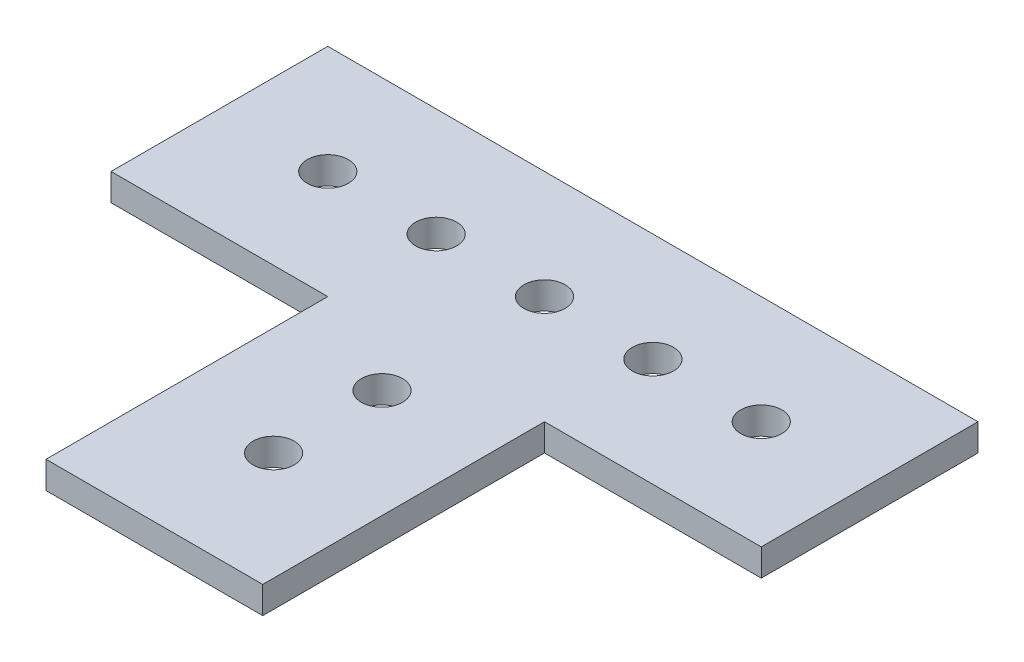
ISO-10303-21;
HEADER;
FILE_DESCRIPTION(('STEP AP214'),'2;1');
FILE_NAME('part.step','',(''),(''),'','','');
FILE_SCHEMA(('AUTOMOTIVE_DESIGN { 1 0 10303 214 1 1 1 1 }'));
ENDSEC;
DATA;
#1=APPLICATION_CONTEXT('core data for automotive mechanical design processes');
#2=APPLICATION_PROTOCOL_DEFINITION('international standard','automotive_design',2000,#1);
#3=PRODUCT_CONTEXT('',#1,'mechanical');
#4=PRODUCT('Part','Part','',(#3));
#5=PRODUCT_RELATED_PRODUCT_CATEGORY('part','',(#4));
#6=PRODUCT_DEFINITION_FORMATION('','',#4);
#7=PRODUCT_DEFINITION_CONTEXT('part definition',#1,'design');
#8=PRODUCT_DEFINITION('design','',#6,#7);
#9=PRODUCT_DEFINITION_SHAPE('','',#8);
#10=(LENGTH_UNIT() NAMED_UNIT(*) SI_UNIT(.MILLI.,.METRE.));
#11=(NAMED_UNIT(*) PLANE_ANGLE_UNIT() SI_UNIT($,.RADIAN.));
#12=(NAMED_UNIT(*) SI_UNIT($,.STERADIAN.) SOLID_ANGLE_UNIT());
#13=UNCERTAINTY_MEASURE_WITH_UNIT(LENGTH_MEASURE(1.E-05),#10,'distance_accuracy_value','');
#14=(GEOMETRIC_REPRESENTATION_CONTEXT(3) GLOBAL_UNCERTAINTY_ASSIGNED_CONTEXT((#13)) GLOBAL_UNIT_ASSIGNED_CONTEXT((#10,
#11,#12)) REPRESENTATION_CONTEXT('',''));
#15=CARTESIAN_POINT('',(0.,0.,0.));
#16=DIRECTION('',(0.,0.,1.));
#17=DIRECTION('',(1.,0.,0.));
#18=AXIS2_PLACEMENT_3D('',#15,#16,#17);
#19=CARTESIAN_POINT('',(0.,3.175,0.));
#20=DIRECTION('',(1.,0.,0.));
#21=DIRECTION('',(0.,0.,-1.));
#22=AXIS2_PLACEMENT_3D('',#19,#20,#21);
#23=PLANE('',#22);
#24=DIRECTION('',(0.,0.,1.));
#25=VECTOR('',#24,1.);
#26=CARTESIAN_POINT('',(0.,0.,0.));
#27=LINE('',#26,#25);
#28=CARTESIAN_POINT('',(0.,0.,-33.02));
#29=VERTEX_POINT('',#28);
#30=CARTESIAN_POINT('',(0.,0.,0.));
#31=VERTEX_POINT('',#30);
#32=EDGE_CURVE('E146',#29,#31,#27,.T.);
#33=ORIENTED_EDGE('',*,*,#32,.T.);
#34=DIRECTION('',(0.,-1.,0.));
#35=VECTOR('',#34,1.);
#36=CARTESIAN_POINT('',(0.,3.175,0.));
#37=LINE('',#36,#35);
#38=CARTESIAN_POINT('',(0.,3.175,0.));
#39=VERTEX_POINT('',#38);
#40=EDGE_CURVE('E11',#39,#31,#37,.T.);
#41=ORIENTED_EDGE('',*,*,#40,.F.);
#42=DIRECTION('',(0.,0.,1.));
#43=VECTOR('',#42,1.);
#44=CARTESIAN_POINT('',(0.,3.175,0.));
#45=LINE('',#44,#43);
#46=CARTESIAN_POINT('',(0.,3.175,-33.02));
#47=VERTEX_POINT('',#46);
#48=EDGE_CURVE('E169',#47,#39,#45,.T.);
#49=ORIENTED_EDGE('',*,*,#48,.F.);
#50=DIRECTION('',(0.,-1.,0.));
#51=VECTOR('',#50,1.);
#52=CARTESIAN_POINT('',(0.,3.175,-33.02));
#53=LINE('',#52,#51);
#54=EDGE_CURVE('E142',#47,#29,#53,.T.);
#55=ORIENTED_EDGE('',*,*,#54,.T.);
#56=EDGE_LOOP('',(#33,#41,#49,#55));
#57=FACE_BOUND('',#56,.T.);
#58=ADVANCED_FACE('F45',(#57),#23,.F.);
#59=CARTESIAN_POINT('',(0.,3.175,0.));
#60=DIRECTION('',(0.,0.,-1.));
#61=DIRECTION('',(-1.,0.,0.));
#62=AXIS2_PLACEMENT_3D('',#59,#60,#61);
#63=PLANE('',#62);
#64=DIRECTION('',(1.,0.,0.));
#65=VECTOR('',#64,1.);
#66=CARTESIAN_POINT('',(0.,0.,0.));
#67=LINE('',#66,#65);
#68=CARTESIAN_POINT('',(25.4,0.,0.));
#69=VERTEX_POINT('',#68);
#70=EDGE_CURVE('E150',#31,#69,#67,.T.);
#71=ORIENTED_EDGE('',*,*,#70,.T.);
#72=DIRECTION('',(0.,-1.,0.));
#73=VECTOR('',#72,1.);
#74=CARTESIAN_POINT('',(25.4,3.175,0.));
#75=LINE('',#74,#73);
#76=CARTESIAN_POINT('',(25.4,3.175,0.));
#77=VERTEX_POINT('',#76);
#78=EDGE_CURVE('E54',#77,#69,#75,.T.);
#79=ORIENTED_EDGE('',*,*,#78,.F.);
#80=DIRECTION('',(1.,0.,0.));
#81=VECTOR('',#80,1.);
#82=CARTESIAN_POINT('',(0.,3.175,0.));
#83=LINE('',#82,#81);
#84=EDGE_CURVE('E105',#39,#77,#83,.T.);
#85=ORIENTED_EDGE('',*,*,#84,.F.);
#86=ORIENTED_EDGE('',*,*,#40,.T.);
#87=EDGE_LOOP('',(#71,#79,#85,#86));
#88=FACE_BOUND('',#87,.T.);
#89=ADVANCED_FACE('F309',(#88),#63,.F.);
#90=CARTESIAN_POINT('',(25.4,3.175,0.));
#91=DIRECTION('',(-1.,0.,0.));
#92=DIRECTION('',(0.,0.,1.));
#93=AXIS2_PLACEMENT_3D('',#90,#91,#92);
#94=PLANE('',#93);
#95=DIRECTION('',(0.,0.,-1.));
#96=VECTOR('',#95,1.);
#97=CARTESIAN_POINT('',(25.4,0.,0.));
#98=LINE('',#97,#96);
#99=CARTESIAN_POINT('',(25.4,0.,-33.02));
#100=VERTEX_POINT('',#99);
#101=EDGE_CURVE('E154',#69,#100,#98,.T.);
#102=ORIENTED_EDGE('',*,*,#101,.T.);
#103=DIRECTION('',(0.,-1.,0.));
#104=VECTOR('',#103,1.);
#105=CARTESIAN_POINT('',(25.4,3.175,-33.02));
#106=LINE('',#105,#104);
#107=CARTESIAN_POINT('',(25.4,3.175,-33.02));
#108=VERTEX_POINT('',#107);
#109=EDGE_CURVE('E180',#108,#100,#106,.T.);
#110=ORIENTED_EDGE('',*,*,#109,.F.);
#111=DIRECTION('',(0.,0.,-1.));
#112=VECTOR('',#111,1.);
#113=CARTESIAN_POINT('',(25.4,3.175,0.));
#114=LINE('',#113,#112);
#115=EDGE_CURVE('E190',#77,#108,#114,.T.);
#116=ORIENTED_EDGE('',*,*,#115,.F.);
#117=ORIENTED_EDGE('',*,*,#78,.T.);
#118=EDGE_LOOP('',(#102,#110,#116,#117));
#119=FACE_BOUND('',#118,.T.);
#120=ADVANCED_FACE('F188',(#119),#94,.F.);
#121=CARTESIAN_POINT('',(25.4,3.175,-33.02));
#122=DIRECTION('',(0.,0.,-1.));
#123=DIRECTION('',(-1.,0.,0.));
#124=AXIS2_PLACEMENT_3D('',#121,#122,#123);
#125=PLANE('',#124);
#126=DIRECTION('',(1.,0.,0.));
#127=VECTOR('',#126,1.);
#128=CARTESIAN_POINT('',(25.4,0.,-33.02));
#129=LINE('',#128,#127);
#130=CARTESIAN_POINT('',(50.8,0.,-33.02));
#131=VERTEX_POINT('',#130);
#132=EDGE_CURVE('E157',#100,#131,#129,.T.);
#133=ORIENTED_EDGE('',*,*,#132,.T.);
#134=DIRECTION('',(0.,-1.,0.));
#135=VECTOR('',#134,1.);
#136=CARTESIAN_POINT('',(50.8,3.175,-33.02));
#137=LINE('',#136,#135);
#138=CARTESIAN_POINT('',(50.8,3.175,-33.02));
#139=VERTEX_POINT('',#138);
#140=EDGE_CURVE('E176',#139,#131,#137,.T.);
#141=ORIENTED_EDGE('',*,*,#140,.F.);
#142=DIRECTION('',(1.,0.,0.));
#143=VECTOR('',#142,1.);
#144=CARTESIAN_POINT('',(25.4,3.175,-33.02));
#145=LINE('',#144,#143);
#146=EDGE_CURVE('E203',#108,#139,#145,.T.);
#147=ORIENTED_EDGE('',*,*,#146,.F.);
#148=ORIENTED_EDGE('',*,*,#109,.T.);
#149=EDGE_LOOP('',(#133,#141,#147,#148));
#150=FACE_BOUND('',#149,.T.);
#151=ADVANCED_FACE('F198',(#150),#125,.F.);
#152=CARTESIAN_POINT('',(50.8,3.175,-33.02));
#153=DIRECTION('',(-1.,0.,0.));
#154=DIRECTION('',(0.,0.,1.));
#155=AXIS2_PLACEMENT_3D('',#152,#153,#154);
#156=PLANE('',#155);
#157=DIRECTION('',(0.,0.,-1.));
#158=VECTOR('',#157,1.);
#159=CARTESIAN_POINT('',(50.8,0.,-33.02));
#160=LINE('',#159,#158);
#161=CARTESIAN_POINT('',(50.8,0.,-58.42));
#162=VERTEX_POINT('',#161);
#163=EDGE_CURVE('E160',#131,#162,#160,.T.);
#164=ORIENTED_EDGE('',*,*,#163,.T.);
#165=DIRECTION('',(0.,-1.,0.));
#166=VECTOR('',#165,1.);
#167=CARTESIAN_POINT('',(50.8,3.175,-58.42));
#168=LINE('',#167,#166);
#169=CARTESIAN_POINT('',(50.8,3.175,-58.42));
#170=VERTEX_POINT('',#169);
#171=EDGE_CURVE('E135',#170,#162,#168,.T.);
#172=ORIENTED_EDGE('',*,*,#171,.F.);
#173=DIRECTION('',(0.,0.,-1.));
#174=VECTOR('',#173,1.);
#175=CARTESIAN_POINT('',(50.8,3.175,-33.02));
#176=LINE('',#175,#174);
#177=EDGE_CURVE('E124',#139,#170,#176,.T.);
#178=ORIENTED_EDGE('',*,*,#177,.F.);
#179=ORIENTED_EDGE('',*,*,#140,.T.);
#180=EDGE_LOOP('',(#164,#172,#178,#179));
#181=FACE_BOUND('',#180,.T.);
#182=ADVANCED_FACE('F201',(#181),#156,.F.);
#183=CARTESIAN_POINT('',(-25.4,3.175,-58.42));
#184=DIRECTION('',(0.,0.,1.));
#185=DIRECTION('',(1.,0.,0.));
#186=AXIS2_PLACEMENT_3D('',#183,#184,#185);
#187=PLANE('',#186);
#188=DIRECTION('',(-1.,0.,0.));
#189=VECTOR('',#188,1.);
#190=CARTESIAN_POINT('',(-25.4,0.,-58.42));
#191=LINE('',#190,#189);
#192=CARTESIAN_POINT('',(-25.4,0.,-58.42));
#193=VERTEX_POINT('',#192);
#194=EDGE_CURVE('E133',#162,#193,#191,.T.);
#195=ORIENTED_EDGE('',*,*,#194,.T.);
#196=DIRECTION('',(0.,-1.,0.));
#197=VECTOR('',#196,1.);
#198=CARTESIAN_POINT('',(-25.4,3.175,-58.42));
#199=LINE('',#198,#197);
#200=CARTESIAN_POINT('',(-25.4,3.175,-58.42));
#201=VERTEX_POINT('',#200);
#202=EDGE_CURVE('E130',#201,#193,#199,.T.);
#203=ORIENTED_EDGE('',*,*,#202,.F.);
#204=DIRECTION('',(-1.,0.,0.));
#205=VECTOR('',#204,1.);
#206=CARTESIAN_POINT('',(-25.4,3.175,-58.42));
#207=LINE('',#206,#205);
#208=EDGE_CURVE('E118',#170,#201,#207,.T.);
#209=ORIENTED_EDGE('',*,*,#208,.F.);
#210=ORIENTED_EDGE('',*,*,#171,.T.);
#211=EDGE_LOOP('',(#195,#203,#209,#210));
#212=FACE_BOUND('',#211,.T.);
#213=ADVANCED_FACE('F131',(#212),#187,.F.);
#214=CARTESIAN_POINT('',(-25.4,3.175,-33.02));
#215=DIRECTION('',(1.,0.,0.));
#216=DIRECTION('',(0.,0.,-1.));
#217=AXIS2_PLACEMENT_3D('',#214,#215,#216);
#218=PLANE('',#217);
#219=DIRECTION('',(0.,0.,1.));
#220=VECTOR('',#219,1.);
#221=CARTESIAN_POINT('',(-25.4,0.,-33.02));
#222=LINE('',#221,#220);
#223=CARTESIAN_POINT('',(-25.4,0.,-33.02));
#224=VERTEX_POINT('',#223);
#225=EDGE_CURVE('E91',#193,#224,#222,.T.);
#226=ORIENTED_EDGE('',*,*,#225,.T.);
#227=DIRECTION('',(0.,-1.,0.));
#228=VECTOR('',#227,1.);
#229=CARTESIAN_POINT('',(-25.4,3.175,-33.02));
#230=LINE('',#229,#228);
#231=CARTESIAN_POINT('',(-25.4,3.175,-33.02));
#232=VERTEX_POINT('',#231);
#233=EDGE_CURVE('E136',#232,#224,#230,.T.);
#234=ORIENTED_EDGE('',*,*,#233,.F.);
#235=DIRECTION('',(0.,0.,1.));
#236=VECTOR('',#235,1.);
#237=CARTESIAN_POINT('',(-25.4,3.175,-33.02));
#238=LINE('',#237,#236);
#239=EDGE_CURVE('E122',#201,#232,#238,.T.);
#240=ORIENTED_EDGE('',*,*,#239,.F.);
#241=ORIENTED_EDGE('',*,*,#202,.T.);
#242=EDGE_LOOP('',(#226,#234,#240,#241));
#243=FACE_BOUND('',#242,.T.);
#244=ADVANCED_FACE('F138',(#243),#218,.F.);
#245=CARTESIAN_POINT('',(-25.4,3.175,-33.02));
#246=DIRECTION('',(0.,0.,-1.));
#247=DIRECTION('',(-1.,0.,0.));
#248=AXIS2_PLACEMENT_3D('',#245,#246,#247);
#249=PLANE('',#248);
#250=DIRECTION('',(1.,0.,0.));
#251=VECTOR('',#250,1.);
#252=CARTESIAN_POINT('',(-25.4,0.,-33.02));
#253=LINE('',#252,#251);
#254=EDGE_CURVE('E97',#224,#29,#253,.T.);
#255=ORIENTED_EDGE('',*,*,#254,.T.);
#256=ORIENTED_EDGE('',*,*,#54,.F.);
#257=DIRECTION('',(1.,0.,0.));
#258=VECTOR('',#257,1.);
#259=CARTESIAN_POINT('',(-25.4,3.175,-33.02));
#260=LINE('',#259,#258);
#261=EDGE_CURVE('E62',#232,#47,#260,.T.);
#262=ORIENTED_EDGE('',*,*,#261,.F.);
#263=ORIENTED_EDGE('',*,*,#233,.T.);
#264=EDGE_LOOP('',(#255,#256,#262,#263));
#265=FACE_BOUND('',#264,.T.);
#266=ADVANCED_FACE('F280',(#265),#249,.F.);
#267=CARTESIAN_POINT('',(0.,3.175,0.));
#268=DIRECTION('',(0.,-1.,0.));
#269=DIRECTION('',(0.,0.,-1.));
#270=AXIS2_PLACEMENT_3D('',#267,#268,#269);
#271=PLANE('',#270);
#272=CARTESIAN_POINT('',(12.7,3.175,-13.97));
#273=DIRECTION('',(0.,1.,0.));
#274=DIRECTION('',(0.,0.,1.));
#275=AXIS2_PLACEMENT_3D('',#272,#273,#274);
#276=CIRCLE('',#275,2.413);
#277=CARTESIAN_POINT('',(12.7,3.175,-11.557));
#278=VERTEX_POINT('',#277);
#279=EDGE_CURVE('E247',#278,#278,#276,.T.);
#280=ORIENTED_EDGE('',*,*,#279,.F.);
#281=EDGE_LOOP('',(#280));
#282=FACE_BOUND('',#281,.T.);
#283=CARTESIAN_POINT('',(12.7,3.175,-45.72));
#284=DIRECTION('',(0.,1.,0.));
#285=DIRECTION('',(0.,0.,1.));
#286=AXIS2_PLACEMENT_3D('',#283,#284,#285);
#287=CIRCLE('',#286,2.413);
#288=CARTESIAN_POINT('',(12.7,3.175,-43.307));
#289=VERTEX_POINT('',#288);
#290=EDGE_CURVE('E229',#289,#289,#287,.T.);
#291=ORIENTED_EDGE('',*,*,#290,.F.);
#292=EDGE_LOOP('',(#291));
#293=FACE_BOUND('',#292,.T.);
#294=CARTESIAN_POINT('',(0.,3.175,-45.72));
#295=DIRECTION('',(0.,1.,0.));
#296=DIRECTION('',(0.,0.,1.));
#297=AXIS2_PLACEMENT_3D('',#294,#295,#296);
#298=CIRCLE('',#297,2.413);
#299=CARTESIAN_POINT('',(0.,3.175,-43.307));
#300=VERTEX_POINT('',#299);
#301=EDGE_CURVE('E255',#300,#300,#298,.T.);
#302=ORIENTED_EDGE('',*,*,#301,.F.);
#303=EDGE_LOOP('',(#302));
#304=FACE_BOUND('',#303,.T.);
#305=CARTESIAN_POINT('',(12.7,3.175,-26.67));
#306=DIRECTION('',(0.,1.,0.));
#307=DIRECTION('',(0.,0.,1.));
#308=AXIS2_PLACEMENT_3D('',#305,#306,#307);
#309=CIRCLE('',#308,2.413);
#310=CARTESIAN_POINT('',(12.7,3.175,-24.257));
#311=VERTEX_POINT('',#310);
#312=EDGE_CURVE('E230',#311,#311,#309,.T.);
#313=ORIENTED_EDGE('',*,*,#312,.F.);
#314=EDGE_LOOP('',(#313));
#315=FACE_BOUND('',#314,.T.);
#316=CARTESIAN_POINT('',(-12.7,3.175,-45.72));
#317=DIRECTION('',(0.,1.,0.));
#318=DIRECTION('',(0.,0.,1.));
#319=AXIS2_PLACEMENT_3D('',#316,#317,#318);
#320=CIRCLE('',#319,2.413);
#321=CARTESIAN_POINT('',(-12.7,3.175,-43.307));
#322=VERTEX_POINT('',#321);
#323=EDGE_CURVE('E239',#322,#322,#320,.T.);
#324=ORIENTED_EDGE('',*,*,#323,.F.);
#325=EDGE_LOOP('',(#324));
#326=FACE_BOUND('',#325,.T.);
#327=CARTESIAN_POINT('',(25.4,3.175,-45.72));
#328=DIRECTION('',(0.,1.,0.));
#329=DIRECTION('',(0.,0.,1.));
#330=AXIS2_PLACEMENT_3D('',#327,#328,#329);
#331=CIRCLE('',#330,2.413);
#332=CARTESIAN_POINT('',(25.4,3.175,-43.307));
#333=VERTEX_POINT('',#332);
#334=EDGE_CURVE('E221',#333,#333,#331,.T.);
#335=ORIENTED_EDGE('',*,*,#334,.F.);
#336=EDGE_LOOP('',(#335));
#337=FACE_BOUND('',#336,.T.);
#338=CARTESIAN_POINT('',(38.1,3.175,-45.72));
#339=DIRECTION('',(0.,1.,0.));
#340=DIRECTION('',(0.,0.,1.));
#341=AXIS2_PLACEMENT_3D('',#338,#339,#340);
#342=CIRCLE('',#341,2.41299999999999);
#343=CARTESIAN_POINT('',(38.1,3.175,-43.307));
#344=VERTEX_POINT('',#343);
#345=EDGE_CURVE('E213',#344,#344,#342,.T.);
#346=ORIENTED_EDGE('',*,*,#345,.F.);
#347=EDGE_LOOP('',(#346));
#348=FACE_BOUND('',#347,.T.);
#349=ORIENTED_EDGE('',*,*,#48,.T.);
#350=ORIENTED_EDGE('',*,*,#84,.T.);
#351=ORIENTED_EDGE('',*,*,#115,.T.);
#352=ORIENTED_EDGE('',*,*,#146,.T.);
#353=ORIENTED_EDGE('',*,*,#177,.T.);
#354=ORIENTED_EDGE('',*,*,#208,.T.);
#355=ORIENTED_EDGE('',*,*,#239,.T.);
#356=ORIENTED_EDGE('',*,*,#261,.T.);
#357=EDGE_LOOP('',(#349,#350,#351,#352,#353,#354,#355,#356));
#358=FACE_BOUND('',#357,.T.);
#359=ADVANCED_FACE('F120',(#282,#293,#304,#315,#326,#337,#348,#358),#271,.F.);
#360=CARTESIAN_POINT('',(0.,0.,0.));
#361=DIRECTION('',(0.,-1.,0.));
#362=DIRECTION('',(0.,0.,-1.));
#363=AXIS2_PLACEMENT_3D('',#360,#361,#362);
#364=PLANE('',#363);
#365=CARTESIAN_POINT('',(12.7,0.,-13.97));
#366=DIRECTION('',(0.,1.,0.));
#367=DIRECTION('',(0.,0.,1.));
#368=AXIS2_PLACEMENT_3D('',#365,#366,#367);
#369=CIRCLE('',#368,2.413);
#370=CARTESIAN_POINT('',(12.7,0.,-11.557));
#371=VERTEX_POINT('',#370);
#372=EDGE_CURVE('E151',#371,#371,#369,.T.);
#373=ORIENTED_EDGE('',*,*,#372,.T.);
#374=EDGE_LOOP('',(#373));
#375=FACE_BOUND('',#374,.T.);
#376=CARTESIAN_POINT('',(12.7,0.,-45.72));
#377=DIRECTION('',(0.,1.,0.));
#378=DIRECTION('',(0.,0.,1.));
#379=AXIS2_PLACEMENT_3D('',#376,#377,#378);
#380=CIRCLE('',#379,2.413);
#381=CARTESIAN_POINT('',(12.7,0.,-43.307));
#382=VERTEX_POINT('',#381);
#383=EDGE_CURVE('E251',#382,#382,#380,.T.);
#384=ORIENTED_EDGE('',*,*,#383,.T.);
#385=EDGE_LOOP('',(#384));
#386=FACE_BOUND('',#385,.T.);
#387=CARTESIAN_POINT('',(0.,0.,-45.72));
#388=DIRECTION('',(0.,1.,0.));
#389=DIRECTION('',(0.,0.,1.));
#390=AXIS2_PLACEMENT_3D('',#387,#388,#389);
#391=CIRCLE('',#390,2.413);
#392=CARTESIAN_POINT('',(0.,0.,-43.307));
#393=VERTEX_POINT('',#392);
#394=EDGE_CURVE('E235',#393,#393,#391,.T.);
#395=ORIENTED_EDGE('',*,*,#394,.T.);
#396=EDGE_LOOP('',(#395));
#397=FACE_BOUND('',#396,.T.);
#398=CARTESIAN_POINT('',(12.7,0.,-26.67));
#399=DIRECTION('',(0.,1.,0.));
#400=DIRECTION('',(0.,0.,1.));
#401=AXIS2_PLACEMENT_3D('',#398,#399,#400);
#402=CIRCLE('',#401,2.413);
#403=CARTESIAN_POINT('',(12.7,0.,-24.257));
#404=VERTEX_POINT('',#403);
#405=EDGE_CURVE('E234',#404,#404,#402,.T.);
#406=ORIENTED_EDGE('',*,*,#405,.T.);
#407=EDGE_LOOP('',(#406));
#408=FACE_BOUND('',#407,.T.);
#409=CARTESIAN_POINT('',(-12.7,0.,-45.72));
#410=DIRECTION('',(0.,1.,0.));
#411=DIRECTION('',(0.,0.,1.));
#412=AXIS2_PLACEMENT_3D('',#409,#410,#411);
#413=CIRCLE('',#412,2.413);
#414=CARTESIAN_POINT('',(-12.7,0.,-43.307));
#415=VERTEX_POINT('',#414);
#416=EDGE_CURVE('E243',#415,#415,#413,.T.);
#417=ORIENTED_EDGE('',*,*,#416,.T.);
#418=EDGE_LOOP('',(#417));
#419=FACE_BOUND('',#418,.T.);
#420=CARTESIAN_POINT('',(25.4,0.,-45.72));
#421=DIRECTION('',(0.,1.,0.));
#422=DIRECTION('',(0.,0.,1.));
#423=AXIS2_PLACEMENT_3D('',#420,#421,#422);
#424=CIRCLE('',#423,2.413);
#425=CARTESIAN_POINT('',(25.4,0.,-43.307));
#426=VERTEX_POINT('',#425);
#427=EDGE_CURVE('E225',#426,#426,#424,.T.);
#428=ORIENTED_EDGE('',*,*,#427,.T.);
#429=EDGE_LOOP('',(#428));
#430=FACE_BOUND('',#429,.T.);
#431=CARTESIAN_POINT('',(38.1,0.,-45.72));
#432=DIRECTION('',(0.,1.,0.));
#433=DIRECTION('',(0.,0.,1.));
#434=AXIS2_PLACEMENT_3D('',#431,#432,#433);
#435=CIRCLE('',#434,2.41299999999999);
#436=CARTESIAN_POINT('',(38.1,0.,-43.307));
#437=VERTEX_POINT('',#436);
#438=EDGE_CURVE('E217',#437,#437,#435,.T.);
#439=ORIENTED_EDGE('',*,*,#438,.T.);
#440=EDGE_LOOP('',(#439));
#441=FACE_BOUND('',#440,.T.);
#442=ORIENTED_EDGE('',*,*,#32,.F.);
#443=ORIENTED_EDGE('',*,*,#254,.F.);
#444=ORIENTED_EDGE('',*,*,#225,.F.);
#445=ORIENTED_EDGE('',*,*,#194,.F.);
#446=ORIENTED_EDGE('',*,*,#163,.F.);
#447=ORIENTED_EDGE('',*,*,#132,.F.);
#448=ORIENTED_EDGE('',*,*,#101,.F.);
#449=ORIENTED_EDGE('',*,*,#70,.F.);
#450=EDGE_LOOP('',(#442,#443,#444,#445,#446,#447,#448,#449));
#451=FACE_BOUND('',#450,.T.);
#452=ADVANCED_FACE('F194',(#375,#386,#397,#408,#419,#430,#441,#451),#364,.T.);
#453=CARTESIAN_POINT('',(38.1,0.,-45.72));
#454=DIRECTION('',(0.,1.,0.));
#455=DIRECTION('',(0.,0.,1.));
#456=AXIS2_PLACEMENT_3D('',#453,#454,#455);
#457=CYLINDRICAL_SURFACE('',#456,2.41299999999999);
#458=ORIENTED_EDGE('',*,*,#438,.F.);
#459=EDGE_LOOP('',(#458));
#460=FACE_BOUND('',#459,.T.);
#461=ORIENTED_EDGE('',*,*,#345,.T.);
#462=EDGE_LOOP('',(#461));
#463=FACE_BOUND('',#462,.T.);
#464=ADVANCED_FACE('F294',(#460,#463),#457,.F.);
#465=CARTESIAN_POINT('',(25.4,0.,-45.72));
#466=DIRECTION('',(0.,1.,0.));
#467=DIRECTION('',(0.,0.,1.));
#468=AXIS2_PLACEMENT_3D('',#465,#466,#467);
#469=CYLINDRICAL_SURFACE('',#468,2.413);
#470=ORIENTED_EDGE('',*,*,#427,.F.);
#471=EDGE_LOOP('',(#470));
#472=FACE_BOUND('',#471,.T.);
#473=ORIENTED_EDGE('',*,*,#334,.T.);
#474=EDGE_LOOP('',(#473));
#475=FACE_BOUND('',#474,.T.);
#476=ADVANCED_FACE('F296',(#472,#475),#469,.F.);
#477=CARTESIAN_POINT('',(-12.7,0.,-45.72));
#478=DIRECTION('',(0.,1.,0.));
#479=DIRECTION('',(0.,0.,1.));
#480=AXIS2_PLACEMENT_3D('',#477,#478,#479);
#481=CYLINDRICAL_SURFACE('',#480,2.413);
#482=ORIENTED_EDGE('',*,*,#416,.F.);
#483=EDGE_LOOP('',(#482));
#484=FACE_BOUND('',#483,.T.);
#485=ORIENTED_EDGE('',*,*,#323,.T.);
#486=EDGE_LOOP('',(#485));
#487=FACE_BOUND('',#486,.T.);
#488=ADVANCED_FACE('F303',(#484,#487),#481,.F.);
#489=CARTESIAN_POINT('',(12.7,0.,-26.67));
#490=DIRECTION('',(0.,1.,0.));
#491=DIRECTION('',(0.,0.,1.));
#492=AXIS2_PLACEMENT_3D('',#489,#490,#491);
#493=CYLINDRICAL_SURFACE('',#492,2.413);
#494=ORIENTED_EDGE('',*,*,#405,.F.);
#495=EDGE_LOOP('',(#494));
#496=FACE_BOUND('',#495,.T.);
#497=ORIENTED_EDGE('',*,*,#312,.T.);
#498=EDGE_LOOP('',(#497));
#499=FACE_BOUND('',#498,.T.);
#500=ADVANCED_FACE('F379',(#496,#499),#493,.F.);
#501=CARTESIAN_POINT('',(0.,0.,-45.72));
#502=DIRECTION('',(0.,1.,0.));
#503=DIRECTION('',(0.,0.,1.));
#504=AXIS2_PLACEMENT_3D('',#501,#502,#503);
#505=CYLINDRICAL_SURFACE('',#504,2.413);
#506=ORIENTED_EDGE('',*,*,#394,.F.);
#507=EDGE_LOOP('',(#506));
#508=FACE_BOUND('',#507,.T.);
#509=ORIENTED_EDGE('',*,*,#301,.T.);
#510=EDGE_LOOP('',(#509));
#511=FACE_BOUND('',#510,.T.);
#512=ADVANCED_FACE('F389',(#508,#511),#505,.F.);
#513=CARTESIAN_POINT('',(12.7,0.,-45.72));
#514=DIRECTION('',(0.,1.,0.));
#515=DIRECTION('',(0.,0.,1.));
#516=AXIS2_PLACEMENT_3D('',#513,#514,#515);
#517=CYLINDRICAL_SURFACE('',#516,2.413);
#518=ORIENTED_EDGE('',*,*,#383,.F.);
#519=EDGE_LOOP('',(#518));
#520=FACE_BOUND('',#519,.T.);
#521=ORIENTED_EDGE('',*,*,#290,.T.);
#522=EDGE_LOOP('',(#521));
#523=FACE_BOUND('',#522,.T.);
#524=ADVANCED_FACE('F274',(#520,#523),#517,.F.);
#525=CARTESIAN_POINT('',(12.7,0.,-13.97));
#526=DIRECTION('',(0.,1.,0.));
#527=DIRECTION('',(0.,0.,1.));
#528=AXIS2_PLACEMENT_3D('',#525,#526,#527);
#529=CYLINDRICAL_SURFACE('',#528,2.413);
#530=ORIENTED_EDGE('',*,*,#372,.F.);
#531=EDGE_LOOP('',(#530));
#532=FACE_BOUND('',#531,.T.);
#533=ORIENTED_EDGE('',*,*,#279,.T.);
#534=EDGE_LOOP('',(#533));
#535=FACE_BOUND('',#534,.T.);
#536=ADVANCED_FACE('F271',(#532,#535),#529,.F.);
#537=CLOSED_SHELL('',(#58,#89,#120,#151,#182,#213,#244,#266,#359,#452,#464,#476,#488,#500,#512,
#524,#536));
#538=MANIFOLD_SOLID_BREP('B2',#537);
#539=ADVANCED_BREP_SHAPE_REPRESENTATION('',(#18,#538),#14);
#540=SHAPE_DEFINITION_REPRESENTATION(#9,#539);
ENDSEC;
END-ISO-10303-21;
